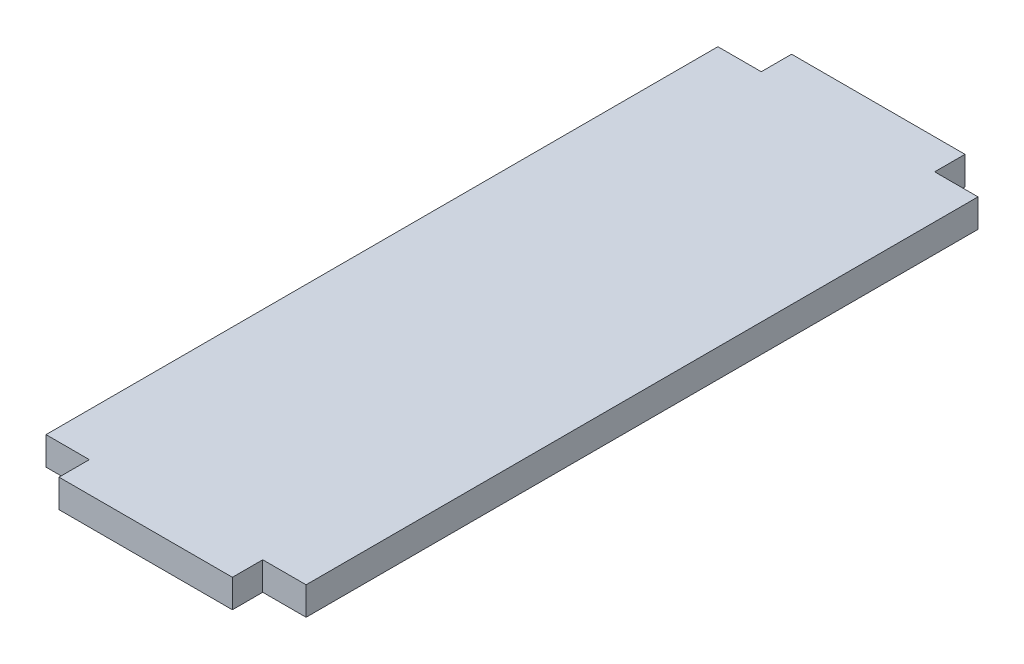
ISO-10303-21;
HEADER;
FILE_DESCRIPTION(('STEP AP214'),'2;1');
FILE_NAME('part.step','',(''),(''),'','','');
FILE_SCHEMA(('AUTOMOTIVE_DESIGN { 1 0 10303 214 1 1 1 1 }'));
ENDSEC;
DATA;
#1=APPLICATION_CONTEXT('core data for automotive mechanical design processes');
#2=APPLICATION_PROTOCOL_DEFINITION('international standard','automotive_design',2000,#1);
#3=PRODUCT_CONTEXT('',#1,'mechanical');
#4=PRODUCT('Part','Part','',(#3));
#5=PRODUCT_RELATED_PRODUCT_CATEGORY('part','',(#4));
#6=PRODUCT_DEFINITION_FORMATION('','',#4);
#7=PRODUCT_DEFINITION_CONTEXT('part definition',#1,'design');
#8=PRODUCT_DEFINITION('design','',#6,#7);
#9=PRODUCT_DEFINITION_SHAPE('','',#8);
#10=(LENGTH_UNIT() NAMED_UNIT(*) SI_UNIT(.MILLI.,.METRE.));
#11=(NAMED_UNIT(*) PLANE_ANGLE_UNIT() SI_UNIT($,.RADIAN.));
#12=(NAMED_UNIT(*) SI_UNIT($,.STERADIAN.) SOLID_ANGLE_UNIT());
#13=UNCERTAINTY_MEASURE_WITH_UNIT(LENGTH_MEASURE(1.E-05),#10,'distance_accuracy_value','');
#14=(GEOMETRIC_REPRESENTATION_CONTEXT(3) GLOBAL_UNCERTAINTY_ASSIGNED_CONTEXT((#13)) GLOBAL_UNIT_ASSIGNED_CONTEXT((#10,
#11,#12)) REPRESENTATION_CONTEXT('',''));
#15=CARTESIAN_POINT('',(0.,0.,0.));
#16=DIRECTION('',(0.,0.,1.));
#17=DIRECTION('',(1.,0.,0.));
#18=AXIS2_PLACEMENT_3D('',#15,#16,#17);
#19=CARTESIAN_POINT('',(-6.,1.3,15.5));
#20=DIRECTION('',(0.,0.,-1.));
#21=DIRECTION('',(-1.,0.,0.));
#22=AXIS2_PLACEMENT_3D('',#19,#20,#21);
#23=PLANE('',#22);
#24=DIRECTION('',(0.,1.,0.));
#25=VECTOR('',#24,1.);
#26=CARTESIAN_POINT('',(4.,0.,15.5));
#27=LINE('',#26,#25);
#28=CARTESIAN_POINT('',(4.,0.,15.5));
#29=VERTEX_POINT('',#28);
#30=CARTESIAN_POINT('',(4.,1.3,15.5));
#31=VERTEX_POINT('',#30);
#32=EDGE_CURVE('E129',#29,#31,#27,.T.);
#33=ORIENTED_EDGE('',*,*,#32,.F.);
#34=DIRECTION('',(1.,0.,0.));
#35=VECTOR('',#34,1.);
#36=CARTESIAN_POINT('',(-6.,0.,15.5));
#37=LINE('',#36,#35);
#38=CARTESIAN_POINT('',(6.,0.,15.5));
#39=VERTEX_POINT('',#38);
#40=EDGE_CURVE('E171',#29,#39,#37,.T.);
#41=ORIENTED_EDGE('',*,*,#40,.T.);
#42=DIRECTION('',(0.,-1.,0.));
#43=VECTOR('',#42,1.);
#44=CARTESIAN_POINT('',(6.,1.3,15.5));
#45=LINE('',#44,#43);
#46=CARTESIAN_POINT('',(6.,1.3,15.5));
#47=VERTEX_POINT('',#46);
#48=EDGE_CURVE('E151',#47,#39,#45,.T.);
#49=ORIENTED_EDGE('',*,*,#48,.F.);
#50=DIRECTION('',(1.,0.,0.));
#51=VECTOR('',#50,1.);
#52=CARTESIAN_POINT('',(-6.,1.3,15.5));
#53=LINE('',#52,#51);
#54=EDGE_CURVE('E144',#31,#47,#53,.T.);
#55=ORIENTED_EDGE('',*,*,#54,.F.);
#56=EDGE_LOOP('',(#33,#41,#49,#55));
#57=FACE_BOUND('',#56,.T.);
#58=ADVANCED_FACE('F40',(#57),#23,.F.);
#59=CARTESIAN_POINT('',(-6.,1.3,-15.5));
#60=DIRECTION('',(0.,0.,1.));
#61=DIRECTION('',(1.,0.,0.));
#62=AXIS2_PLACEMENT_3D('',#59,#60,#61);
#63=PLANE('',#62);
#64=DIRECTION('',(0.,1.,0.));
#65=VECTOR('',#64,1.);
#66=CARTESIAN_POINT('',(-4.,0.,-15.5));
#67=LINE('',#66,#65);
#68=CARTESIAN_POINT('',(-4.,0.,-15.5));
#69=VERTEX_POINT('',#68);
#70=CARTESIAN_POINT('',(-4.,1.3,-15.5));
#71=VERTEX_POINT('',#70);
#72=EDGE_CURVE('E210',#69,#71,#67,.T.);
#73=ORIENTED_EDGE('',*,*,#72,.F.);
#74=DIRECTION('',(-1.,0.,0.));
#75=VECTOR('',#74,1.);
#76=CARTESIAN_POINT('',(-6.,0.,-15.5));
#77=LINE('',#76,#75);
#78=CARTESIAN_POINT('',(-6.,0.,-15.5));
#79=VERTEX_POINT('',#78);
#80=EDGE_CURVE('E164',#69,#79,#77,.T.);
#81=ORIENTED_EDGE('',*,*,#80,.T.);
#82=DIRECTION('',(0.,-1.,0.));
#83=VECTOR('',#82,1.);
#84=CARTESIAN_POINT('',(-6.,1.3,-15.5));
#85=LINE('',#84,#83);
#86=CARTESIAN_POINT('',(-6.,1.3,-15.5));
#87=VERTEX_POINT('',#86);
#88=EDGE_CURVE('E48',#87,#79,#85,.T.);
#89=ORIENTED_EDGE('',*,*,#88,.F.);
#90=DIRECTION('',(-1.,0.,0.));
#91=VECTOR('',#90,1.);
#92=CARTESIAN_POINT('',(-6.,1.3,-15.5));
#93=LINE('',#92,#91);
#94=EDGE_CURVE('E202',#71,#87,#93,.T.);
#95=ORIENTED_EDGE('',*,*,#94,.F.);
#96=EDGE_LOOP('',(#73,#81,#89,#95));
#97=FACE_BOUND('',#96,.T.);
#98=ADVANCED_FACE('F254',(#97),#63,.F.);
#99=CARTESIAN_POINT('',(6.,1.3,-15.5));
#100=DIRECTION('',(-1.,0.,0.));
#101=DIRECTION('',(0.,0.,1.));
#102=AXIS2_PLACEMENT_3D('',#99,#100,#101);
#103=PLANE('',#102);
#104=DIRECTION('',(0.,0.,-1.));
#105=VECTOR('',#104,1.);
#106=CARTESIAN_POINT('',(6.,0.,-15.5));
#107=LINE('',#106,#105);
#108=CARTESIAN_POINT('',(6.,0.,-15.5));
#109=VERTEX_POINT('',#108);
#110=EDGE_CURVE('E161',#39,#109,#107,.T.);
#111=ORIENTED_EDGE('',*,*,#110,.T.);
#112=DIRECTION('',(0.,-1.,0.));
#113=VECTOR('',#112,1.);
#114=CARTESIAN_POINT('',(6.,1.3,-15.5));
#115=LINE('',#114,#113);
#116=CARTESIAN_POINT('',(6.,1.3,-15.5));
#117=VERTEX_POINT('',#116);
#118=EDGE_CURVE('E11',#117,#109,#115,.T.);
#119=ORIENTED_EDGE('',*,*,#118,.F.);
#120=DIRECTION('',(0.,0.,-1.));
#121=VECTOR('',#120,1.);
#122=CARTESIAN_POINT('',(6.,1.3,-15.5));
#123=LINE('',#122,#121);
#124=EDGE_CURVE('E175',#47,#117,#123,.T.);
#125=ORIENTED_EDGE('',*,*,#124,.F.);
#126=ORIENTED_EDGE('',*,*,#48,.T.);
#127=EDGE_LOOP('',(#111,#119,#125,#126));
#128=FACE_BOUND('',#127,.T.);
#129=ADVANCED_FACE('F42',(#128),#103,.F.);
#130=CARTESIAN_POINT('',(4.,0.,-15.5));
#131=VERTEX_POINT('',#130);
#132=EDGE_CURVE('E166',#109,#131,#77,.T.);
#133=ORIENTED_EDGE('',*,*,#132,.T.);
#134=DIRECTION('',(0.,1.,0.));
#135=VECTOR('',#134,1.);
#136=CARTESIAN_POINT('',(4.,0.,-15.5));
#137=LINE('',#136,#135);
#138=CARTESIAN_POINT('',(4.,1.3,-15.5));
#139=VERTEX_POINT('',#138);
#140=EDGE_CURVE('E212',#131,#139,#137,.T.);
#141=ORIENTED_EDGE('',*,*,#140,.T.);
#142=EDGE_CURVE('E157',#117,#139,#93,.T.);
#143=ORIENTED_EDGE('',*,*,#142,.F.);
#144=ORIENTED_EDGE('',*,*,#118,.T.);
#145=EDGE_LOOP('',(#133,#141,#143,#144));
#146=FACE_BOUND('',#145,.T.);
#147=ADVANCED_FACE('F246',(#146),#63,.F.);
#148=CARTESIAN_POINT('',(-6.,1.3,-15.5));
#149=DIRECTION('',(1.,0.,0.));
#150=DIRECTION('',(0.,0.,-1.));
#151=AXIS2_PLACEMENT_3D('',#148,#149,#150);
#152=PLANE('',#151);
#153=DIRECTION('',(0.,0.,1.));
#154=VECTOR('',#153,1.);
#155=CARTESIAN_POINT('',(-6.,0.,-15.5));
#156=LINE('',#155,#154);
#157=CARTESIAN_POINT('',(-6.,0.,15.5));
#158=VERTEX_POINT('',#157);
#159=EDGE_CURVE('E169',#79,#158,#156,.T.);
#160=ORIENTED_EDGE('',*,*,#159,.T.);
#161=DIRECTION('',(0.,-1.,0.));
#162=VECTOR('',#161,1.);
#163=CARTESIAN_POINT('',(-6.,1.3,15.5));
#164=LINE('',#163,#162);
#165=CARTESIAN_POINT('',(-6.,1.3,15.5));
#166=VERTEX_POINT('',#165);
#167=EDGE_CURVE('E177',#166,#158,#164,.T.);
#168=ORIENTED_EDGE('',*,*,#167,.F.);
#169=DIRECTION('',(0.,0.,1.));
#170=VECTOR('',#169,1.);
#171=CARTESIAN_POINT('',(-6.,1.3,-15.5));
#172=LINE('',#171,#170);
#173=EDGE_CURVE('E154',#87,#166,#172,.T.);
#174=ORIENTED_EDGE('',*,*,#173,.F.);
#175=ORIENTED_EDGE('',*,*,#88,.T.);
#176=EDGE_LOOP('',(#160,#168,#174,#175));
#177=FACE_BOUND('',#176,.T.);
#178=ADVANCED_FACE('F184',(#177),#152,.F.);
#179=CARTESIAN_POINT('',(-4.,0.,15.5));
#180=VERTEX_POINT('',#179);
#181=EDGE_CURVE('E172',#158,#180,#37,.T.);
#182=ORIENTED_EDGE('',*,*,#181,.T.);
#183=DIRECTION('',(0.,1.,0.));
#184=VECTOR('',#183,1.);
#185=CARTESIAN_POINT('',(-4.,0.,15.5));
#186=LINE('',#185,#184);
#187=CARTESIAN_POINT('',(-4.,1.3,15.5));
#188=VERTEX_POINT('',#187);
#189=EDGE_CURVE('E200',#180,#188,#186,.T.);
#190=ORIENTED_EDGE('',*,*,#189,.T.);
#191=EDGE_CURVE('E153',#166,#188,#53,.T.);
#192=ORIENTED_EDGE('',*,*,#191,.F.);
#193=ORIENTED_EDGE('',*,*,#167,.T.);
#194=EDGE_LOOP('',(#182,#190,#192,#193));
#195=FACE_BOUND('',#194,.T.);
#196=ADVANCED_FACE('F198',(#195),#23,.F.);
#197=CARTESIAN_POINT('',(0.,1.3,0.));
#198=DIRECTION('',(0.,1.,0.));
#199=DIRECTION('',(0.,0.,1.));
#200=AXIS2_PLACEMENT_3D('',#197,#198,#199);
#201=PLANE('',#200);
#202=ORIENTED_EDGE('',*,*,#124,.T.);
#203=ORIENTED_EDGE('',*,*,#142,.T.);
#204=DIRECTION('',(0.,0.,-1.));
#205=VECTOR('',#204,1.);
#206=CARTESIAN_POINT('',(4.,1.3,-15.5));
#207=LINE('',#206,#205);
#208=CARTESIAN_POINT('',(4.,1.3,-16.9));
#209=VERTEX_POINT('',#208);
#210=EDGE_CURVE('E63',#139,#209,#207,.T.);
#211=ORIENTED_EDGE('',*,*,#210,.T.);
#212=DIRECTION('',(-1.,0.,0.));
#213=VECTOR('',#212,1.);
#214=CARTESIAN_POINT('',(-4.,1.3,-16.9));
#215=LINE('',#214,#213);
#216=CARTESIAN_POINT('',(-4.,1.3,-16.9));
#217=VERTEX_POINT('',#216);
#218=EDGE_CURVE('E218',#209,#217,#215,.T.);
#219=ORIENTED_EDGE('',*,*,#218,.T.);
#220=DIRECTION('',(0.,0.,1.));
#221=VECTOR('',#220,1.);
#222=CARTESIAN_POINT('',(-4.,1.3,-15.5));
#223=LINE('',#222,#221);
#224=EDGE_CURVE('E205',#217,#71,#223,.T.);
#225=ORIENTED_EDGE('',*,*,#224,.T.);
#226=ORIENTED_EDGE('',*,*,#94,.T.);
#227=ORIENTED_EDGE('',*,*,#173,.T.);
#228=ORIENTED_EDGE('',*,*,#191,.T.);
#229=DIRECTION('',(0.,0.,1.));
#230=VECTOR('',#229,1.);
#231=CARTESIAN_POINT('',(-4.,1.3,15.5));
#232=LINE('',#231,#230);
#233=CARTESIAN_POINT('',(-4.,1.3,16.9));
#234=VERTEX_POINT('',#233);
#235=EDGE_CURVE('E55',#188,#234,#232,.T.);
#236=ORIENTED_EDGE('',*,*,#235,.T.);
#237=DIRECTION('',(1.,0.,0.));
#238=VECTOR('',#237,1.);
#239=CARTESIAN_POINT('',(-4.,1.3,16.9));
#240=LINE('',#239,#238);
#241=CARTESIAN_POINT('',(4.,1.3,16.9));
#242=VERTEX_POINT('',#241);
#243=EDGE_CURVE('E147',#234,#242,#240,.T.);
#244=ORIENTED_EDGE('',*,*,#243,.T.);
#245=DIRECTION('',(0.,0.,-1.));
#246=VECTOR('',#245,1.);
#247=CARTESIAN_POINT('',(4.,1.3,15.5));
#248=LINE('',#247,#246);
#249=EDGE_CURVE('E132',#242,#31,#248,.T.);
#250=ORIENTED_EDGE('',*,*,#249,.T.);
#251=ORIENTED_EDGE('',*,*,#54,.T.);
#252=EDGE_LOOP('',(#202,#203,#211,#219,#225,#226,#227,#228,#236,#244,#250,#251));
#253=FACE_BOUND('',#252,.T.);
#254=ADVANCED_FACE('F143',(#253),#201,.T.);
#255=CARTESIAN_POINT('',(0.,0.,0.));
#256=DIRECTION('',(0.,1.,0.));
#257=DIRECTION('',(0.,0.,1.));
#258=AXIS2_PLACEMENT_3D('',#255,#256,#257);
#259=PLANE('',#258);
#260=ORIENTED_EDGE('',*,*,#110,.F.);
#261=ORIENTED_EDGE('',*,*,#40,.F.);
#262=DIRECTION('',(0.,0.,-1.));
#263=VECTOR('',#262,1.);
#264=CARTESIAN_POINT('',(4.,0.,15.5));
#265=LINE('',#264,#263);
#266=CARTESIAN_POINT('',(4.,0.,16.9));
#267=VERTEX_POINT('',#266);
#268=EDGE_CURVE('E134',#267,#29,#265,.T.);
#269=ORIENTED_EDGE('',*,*,#268,.F.);
#270=DIRECTION('',(1.,0.,0.));
#271=VECTOR('',#270,1.);
#272=CARTESIAN_POINT('',(-4.,0.,16.9));
#273=LINE('',#272,#271);
#274=CARTESIAN_POINT('',(-4.,0.,16.9));
#275=VERTEX_POINT('',#274);
#276=EDGE_CURVE('E230',#275,#267,#273,.T.);
#277=ORIENTED_EDGE('',*,*,#276,.F.);
#278=DIRECTION('',(0.,0.,1.));
#279=VECTOR('',#278,1.);
#280=CARTESIAN_POINT('',(-4.,0.,15.5));
#281=LINE('',#280,#279);
#282=EDGE_CURVE('E148',#180,#275,#281,.T.);
#283=ORIENTED_EDGE('',*,*,#282,.F.);
#284=ORIENTED_EDGE('',*,*,#181,.F.);
#285=ORIENTED_EDGE('',*,*,#159,.F.);
#286=ORIENTED_EDGE('',*,*,#80,.F.);
#287=DIRECTION('',(0.,0.,1.));
#288=VECTOR('',#287,1.);
#289=CARTESIAN_POINT('',(-4.,0.,-15.5));
#290=LINE('',#289,#288);
#291=CARTESIAN_POINT('',(-4.,0.,-16.9));
#292=VERTEX_POINT('',#291);
#293=EDGE_CURVE('E220',#292,#69,#290,.T.);
#294=ORIENTED_EDGE('',*,*,#293,.F.);
#295=DIRECTION('',(-1.,0.,0.));
#296=VECTOR('',#295,1.);
#297=CARTESIAN_POINT('',(-4.,0.,-16.9));
#298=LINE('',#297,#296);
#299=CARTESIAN_POINT('',(4.,0.,-16.9));
#300=VERTEX_POINT('',#299);
#301=EDGE_CURVE('E213',#300,#292,#298,.T.);
#302=ORIENTED_EDGE('',*,*,#301,.F.);
#303=DIRECTION('',(0.,0.,-1.));
#304=VECTOR('',#303,1.);
#305=CARTESIAN_POINT('',(4.,0.,-15.5));
#306=LINE('',#305,#304);
#307=EDGE_CURVE('E225',#131,#300,#306,.T.);
#308=ORIENTED_EDGE('',*,*,#307,.F.);
#309=ORIENTED_EDGE('',*,*,#132,.F.);
#310=EDGE_LOOP('',(#260,#261,#269,#277,#283,#284,#285,#286,#294,#302,#308,#309));
#311=FACE_BOUND('',#310,.T.);
#312=ADVANCED_FACE('F192',(#311),#259,.F.);
#313=CARTESIAN_POINT('',(-4.,0.,-15.5));
#314=DIRECTION('',(-1.,0.,0.));
#315=DIRECTION('',(0.,0.,1.));
#316=AXIS2_PLACEMENT_3D('',#313,#314,#315);
#317=PLANE('',#316);
#318=ORIENTED_EDGE('',*,*,#224,.F.);
#319=DIRECTION('',(0.,1.,0.));
#320=VECTOR('',#319,1.);
#321=CARTESIAN_POINT('',(-4.,0.,-16.9));
#322=LINE('',#321,#320);
#323=EDGE_CURVE('E165',#292,#217,#322,.T.);
#324=ORIENTED_EDGE('',*,*,#323,.F.);
#325=ORIENTED_EDGE('',*,*,#293,.T.);
#326=ORIENTED_EDGE('',*,*,#72,.T.);
#327=EDGE_LOOP('',(#318,#324,#325,#326));
#328=FACE_BOUND('',#327,.T.);
#329=ADVANCED_FACE('F253',(#328),#317,.T.);
#330=CARTESIAN_POINT('',(-4.,0.,-16.9));
#331=DIRECTION('',(0.,0.,-1.));
#332=DIRECTION('',(-1.,0.,0.));
#333=AXIS2_PLACEMENT_3D('',#330,#331,#332);
#334=PLANE('',#333);
#335=ORIENTED_EDGE('',*,*,#218,.F.);
#336=DIRECTION('',(0.,1.,0.));
#337=VECTOR('',#336,1.);
#338=CARTESIAN_POINT('',(4.,0.,-16.9));
#339=LINE('',#338,#337);
#340=EDGE_CURVE('E215',#300,#209,#339,.T.);
#341=ORIENTED_EDGE('',*,*,#340,.F.);
#342=ORIENTED_EDGE('',*,*,#301,.T.);
#343=ORIENTED_EDGE('',*,*,#323,.T.);
#344=EDGE_LOOP('',(#335,#341,#342,#343));
#345=FACE_BOUND('',#344,.T.);
#346=ADVANCED_FACE('F251',(#345),#334,.T.);
#347=CARTESIAN_POINT('',(4.,0.,-15.5));
#348=DIRECTION('',(1.,0.,0.));
#349=DIRECTION('',(0.,0.,-1.));
#350=AXIS2_PLACEMENT_3D('',#347,#348,#349);
#351=PLANE('',#350);
#352=ORIENTED_EDGE('',*,*,#210,.F.);
#353=ORIENTED_EDGE('',*,*,#140,.F.);
#354=ORIENTED_EDGE('',*,*,#307,.T.);
#355=ORIENTED_EDGE('',*,*,#340,.T.);
#356=EDGE_LOOP('',(#352,#353,#354,#355));
#357=FACE_BOUND('',#356,.T.);
#358=ADVANCED_FACE('F248',(#357),#351,.T.);
#359=CARTESIAN_POINT('',(4.,0.,15.5));
#360=DIRECTION('',(1.,0.,0.));
#361=DIRECTION('',(0.,0.,-1.));
#362=AXIS2_PLACEMENT_3D('',#359,#360,#361);
#363=PLANE('',#362);
#364=ORIENTED_EDGE('',*,*,#249,.F.);
#365=DIRECTION('',(0.,1.,0.));
#366=VECTOR('',#365,1.);
#367=CARTESIAN_POINT('',(4.,0.,16.9));
#368=LINE('',#367,#366);
#369=EDGE_CURVE('E138',#267,#242,#368,.T.);
#370=ORIENTED_EDGE('',*,*,#369,.F.);
#371=ORIENTED_EDGE('',*,*,#268,.T.);
#372=ORIENTED_EDGE('',*,*,#32,.T.);
#373=EDGE_LOOP('',(#364,#370,#371,#372));
#374=FACE_BOUND('',#373,.T.);
#375=ADVANCED_FACE('F131',(#374),#363,.T.);
#376=CARTESIAN_POINT('',(-4.,0.,16.9));
#377=DIRECTION('',(0.,0.,1.));
#378=DIRECTION('',(1.,0.,0.));
#379=AXIS2_PLACEMENT_3D('',#376,#377,#378);
#380=PLANE('',#379);
#381=ORIENTED_EDGE('',*,*,#243,.F.);
#382=DIRECTION('',(0.,1.,0.));
#383=VECTOR('',#382,1.);
#384=CARTESIAN_POINT('',(-4.,0.,16.9));
#385=LINE('',#384,#383);
#386=EDGE_CURVE('E237',#275,#234,#385,.T.);
#387=ORIENTED_EDGE('',*,*,#386,.F.);
#388=ORIENTED_EDGE('',*,*,#276,.T.);
#389=ORIENTED_EDGE('',*,*,#369,.T.);
#390=EDGE_LOOP('',(#381,#387,#388,#389));
#391=FACE_BOUND('',#390,.T.);
#392=ADVANCED_FACE('F241',(#391),#380,.T.);
#393=CARTESIAN_POINT('',(-4.,0.,15.5));
#394=DIRECTION('',(-1.,0.,0.));
#395=DIRECTION('',(0.,0.,1.));
#396=AXIS2_PLACEMENT_3D('',#393,#394,#395);
#397=PLANE('',#396);
#398=ORIENTED_EDGE('',*,*,#235,.F.);
#399=ORIENTED_EDGE('',*,*,#189,.F.);
#400=ORIENTED_EDGE('',*,*,#282,.T.);
#401=ORIENTED_EDGE('',*,*,#386,.T.);
#402=EDGE_LOOP('',(#398,#399,#400,#401));
#403=FACE_BOUND('',#402,.T.);
#404=ADVANCED_FACE('F239',(#403),#397,.T.);
#405=CLOSED_SHELL('',(#58,#98,#129,#147,#178,#196,#254,#312,#329,#346,#358,#375,#392,#404));
#406=MANIFOLD_SOLID_BREP('B2',#405);
#407=ADVANCED_BREP_SHAPE_REPRESENTATION('',(#18,#406),#14);
#408=SHAPE_DEFINITION_REPRESENTATION(#9,#407);
ENDSEC;
END-ISO-10303-21;
